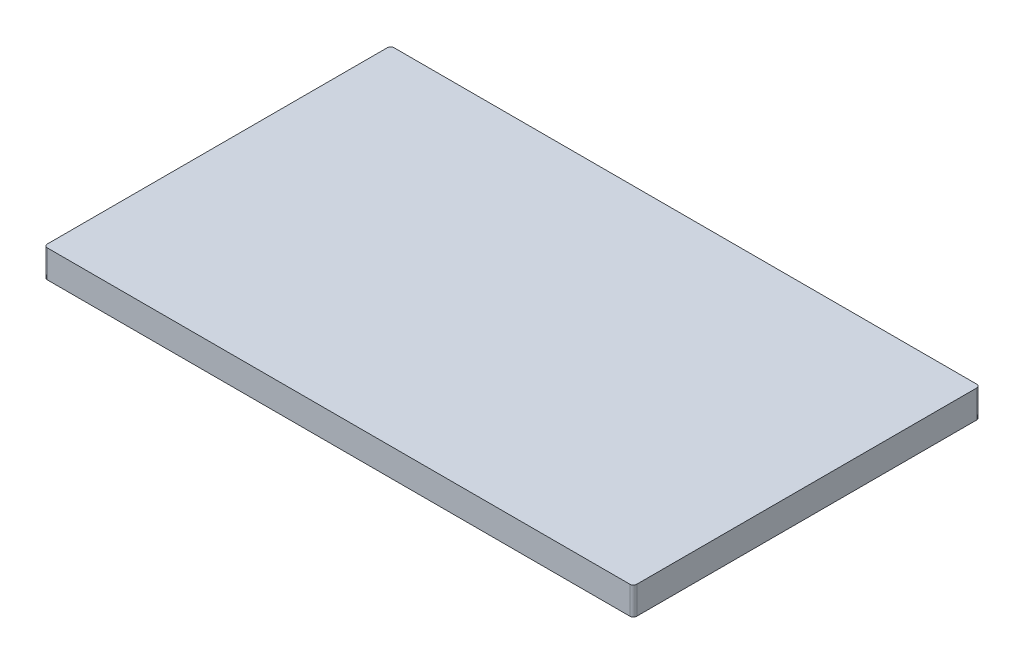
ISO-10303-21;
HEADER;
FILE_DESCRIPTION(('STEP AP214'),'2;1');
FILE_NAME('part.step','',(''),(''),'','','');
FILE_SCHEMA(('AUTOMOTIVE_DESIGN { 1 0 10303 214 1 1 1 1 }'));
ENDSEC;
DATA;
#1=APPLICATION_CONTEXT('core data for automotive mechanical design processes');
#2=APPLICATION_PROTOCOL_DEFINITION('international standard','automotive_design',2000,#1);
#3=PRODUCT_CONTEXT('',#1,'mechanical');
#4=PRODUCT('Part','Part','',(#3));
#5=PRODUCT_RELATED_PRODUCT_CATEGORY('part','',(#4));
#6=PRODUCT_DEFINITION_FORMATION('','',#4);
#7=PRODUCT_DEFINITION_CONTEXT('part definition',#1,'design');
#8=PRODUCT_DEFINITION('design','',#6,#7);
#9=PRODUCT_DEFINITION_SHAPE('','',#8);
#10=(LENGTH_UNIT() NAMED_UNIT(*) SI_UNIT(.MILLI.,.METRE.));
#11=(NAMED_UNIT(*) PLANE_ANGLE_UNIT() SI_UNIT($,.RADIAN.));
#12=(NAMED_UNIT(*) SI_UNIT($,.STERADIAN.) SOLID_ANGLE_UNIT());
#13=UNCERTAINTY_MEASURE_WITH_UNIT(LENGTH_MEASURE(1.E-05),#10,'distance_accuracy_value','');
#14=(GEOMETRIC_REPRESENTATION_CONTEXT(3) GLOBAL_UNCERTAINTY_ASSIGNED_CONTEXT((#13)) GLOBAL_UNIT_ASSIGNED_CONTEXT((#10,
#11,#12)) REPRESENTATION_CONTEXT('',''));
#15=CARTESIAN_POINT('',(0.,0.,0.));
#16=DIRECTION('',(0.,0.,1.));
#17=DIRECTION('',(1.,0.,0.));
#18=AXIS2_PLACEMENT_3D('',#15,#16,#17);
#19=CARTESIAN_POINT('',(0.,8.,0.));
#20=DIRECTION('',(1.,0.,0.));
#21=DIRECTION('',(0.,0.,-1.));
#22=AXIS2_PLACEMENT_3D('',#19,#20,#21);
#23=PLANE('',#22);
#24=DIRECTION('',(0.,0.,1.));
#25=VECTOR('',#24,1.);
#26=CARTESIAN_POINT('',(0.,8.,0.));
#27=LINE('',#26,#25);
#28=CARTESIAN_POINT('',(0.,8.,-99.));
#29=VERTEX_POINT('',#28);
#30=CARTESIAN_POINT('',(0.,8.,-1.));
#31=VERTEX_POINT('',#30);
#32=EDGE_CURVE('E125',#29,#31,#27,.T.);
#33=ORIENTED_EDGE('',*,*,#32,.F.);
#34=DIRECTION('',(0.,-1.,0.));
#35=VECTOR('',#34,1.);
#36=CARTESIAN_POINT('',(0.,8.,-99.));
#37=LINE('',#36,#35);
#38=CARTESIAN_POINT('',(0.,0.,-99.));
#39=VERTEX_POINT('',#38);
#40=EDGE_CURVE('E109',#29,#39,#37,.T.);
#41=ORIENTED_EDGE('',*,*,#40,.T.);
#42=DIRECTION('',(0.,0.,1.));
#43=VECTOR('',#42,1.);
#44=CARTESIAN_POINT('',(0.,0.,0.));
#45=LINE('',#44,#43);
#46=CARTESIAN_POINT('',(0.,0.,-1.));
#47=VERTEX_POINT('',#46);
#48=EDGE_CURVE('E122',#39,#47,#45,.T.);
#49=ORIENTED_EDGE('',*,*,#48,.T.);
#50=DIRECTION('',(0.,-1.,0.));
#51=VECTOR('',#50,1.);
#52=CARTESIAN_POINT('',(0.,8.,-1.));
#53=LINE('',#52,#51);
#54=EDGE_CURVE('E128',#47,#31,#53,.F.);
#55=ORIENTED_EDGE('',*,*,#54,.T.);
#56=EDGE_LOOP('',(#33,#41,#49,#55));
#57=FACE_BOUND('',#56,.T.);
#58=ADVANCED_FACE('F38',(#57),#23,.F.);
#59=CARTESIAN_POINT('',(0.,8.,0.));
#60=DIRECTION('',(0.,0.,-1.));
#61=DIRECTION('',(-1.,0.,0.));
#62=AXIS2_PLACEMENT_3D('',#59,#60,#61);
#63=PLANE('',#62);
#64=DIRECTION('',(1.,0.,0.));
#65=VECTOR('',#64,1.);
#66=CARTESIAN_POINT('',(0.,0.,0.));
#67=LINE('',#66,#65);
#68=CARTESIAN_POINT('',(1.,0.,0.));
#69=VERTEX_POINT('',#68);
#70=CARTESIAN_POINT('',(169.,0.,0.));
#71=VERTEX_POINT('',#70);
#72=EDGE_CURVE('E133',#69,#71,#67,.T.);
#73=ORIENTED_EDGE('',*,*,#72,.T.);
#74=DIRECTION('',(0.,-1.,0.));
#75=VECTOR('',#74,1.);
#76=CARTESIAN_POINT('',(169.,8.,0.));
#77=LINE('',#76,#75);
#78=CARTESIAN_POINT('',(169.,8.,0.));
#79=VERTEX_POINT('',#78);
#80=EDGE_CURVE('E11',#71,#79,#77,.F.);
#81=ORIENTED_EDGE('',*,*,#80,.T.);
#82=DIRECTION('',(1.,0.,0.));
#83=VECTOR('',#82,1.);
#84=CARTESIAN_POINT('',(0.,8.,0.));
#85=LINE('',#84,#83);
#86=CARTESIAN_POINT('',(1.,8.,0.));
#87=VERTEX_POINT('',#86);
#88=EDGE_CURVE('E185',#87,#79,#85,.T.);
#89=ORIENTED_EDGE('',*,*,#88,.F.);
#90=DIRECTION('',(0.,-1.,0.));
#91=VECTOR('',#90,1.);
#92=CARTESIAN_POINT('',(1.,8.,0.));
#93=LINE('',#92,#91);
#94=EDGE_CURVE('E47',#87,#69,#93,.T.);
#95=ORIENTED_EDGE('',*,*,#94,.T.);
#96=EDGE_LOOP('',(#73,#81,#89,#95));
#97=FACE_BOUND('',#96,.T.);
#98=ADVANCED_FACE('F183',(#97),#63,.F.);
#99=CARTESIAN_POINT('',(170.,8.,0.));
#100=DIRECTION('',(-1.,0.,0.));
#101=DIRECTION('',(0.,0.,1.));
#102=AXIS2_PLACEMENT_3D('',#99,#100,#101);
#103=PLANE('',#102);
#104=DIRECTION('',(0.,0.,-1.));
#105=VECTOR('',#104,1.);
#106=CARTESIAN_POINT('',(170.,0.,0.));
#107=LINE('',#106,#105);
#108=CARTESIAN_POINT('',(170.,0.,-1.));
#109=VERTEX_POINT('',#108);
#110=CARTESIAN_POINT('',(170.,0.,-99.));
#111=VERTEX_POINT('',#110);
#112=EDGE_CURVE('E137',#109,#111,#107,.T.);
#113=ORIENTED_EDGE('',*,*,#112,.T.);
#114=DIRECTION('',(0.,-1.,0.));
#115=VECTOR('',#114,1.);
#116=CARTESIAN_POINT('',(170.,8.,-99.));
#117=LINE('',#116,#115);
#118=CARTESIAN_POINT('',(170.,8.,-99.));
#119=VERTEX_POINT('',#118);
#120=EDGE_CURVE('E54',#111,#119,#117,.F.);
#121=ORIENTED_EDGE('',*,*,#120,.T.);
#122=DIRECTION('',(0.,0.,-1.));
#123=VECTOR('',#122,1.);
#124=CARTESIAN_POINT('',(170.,8.,0.));
#125=LINE('',#124,#123);
#126=CARTESIAN_POINT('',(170.,8.,-1.));
#127=VERTEX_POINT('',#126);
#128=EDGE_CURVE('E193',#127,#119,#125,.T.);
#129=ORIENTED_EDGE('',*,*,#128,.F.);
#130=DIRECTION('',(0.,-1.,0.));
#131=VECTOR('',#130,1.);
#132=CARTESIAN_POINT('',(170.,8.,-1.));
#133=LINE('',#132,#131);
#134=EDGE_CURVE('E173',#127,#109,#133,.T.);
#135=ORIENTED_EDGE('',*,*,#134,.T.);
#136=EDGE_LOOP('',(#113,#121,#129,#135));
#137=FACE_BOUND('',#136,.T.);
#138=ADVANCED_FACE('F192',(#137),#103,.F.);
#139=CARTESIAN_POINT('',(0.,8.,-100.));
#140=DIRECTION('',(0.,0.,1.));
#141=DIRECTION('',(1.,0.,0.));
#142=AXIS2_PLACEMENT_3D('',#139,#140,#141);
#143=PLANE('',#142);
#144=DIRECTION('',(-1.,0.,0.));
#145=VECTOR('',#144,1.);
#146=CARTESIAN_POINT('',(0.,0.,-100.));
#147=LINE('',#146,#145);
#148=CARTESIAN_POINT('',(169.,0.,-100.));
#149=VERTEX_POINT('',#148);
#150=CARTESIAN_POINT('',(1.,0.,-100.));
#151=VERTEX_POINT('',#150);
#152=EDGE_CURVE('E145',#149,#151,#147,.T.);
#153=ORIENTED_EDGE('',*,*,#152,.T.);
#154=DIRECTION('',(0.,-1.,0.));
#155=VECTOR('',#154,1.);
#156=CARTESIAN_POINT('',(1.,8.,-100.));
#157=LINE('',#156,#155);
#158=CARTESIAN_POINT('',(1.,8.,-100.));
#159=VERTEX_POINT('',#158);
#160=EDGE_CURVE('E110',#151,#159,#157,.F.);
#161=ORIENTED_EDGE('',*,*,#160,.T.);
#162=DIRECTION('',(-1.,0.,0.));
#163=VECTOR('',#162,1.);
#164=CARTESIAN_POINT('',(0.,8.,-100.));
#165=LINE('',#164,#163);
#166=CARTESIAN_POINT('',(169.,8.,-100.));
#167=VERTEX_POINT('',#166);
#168=EDGE_CURVE('E140',#167,#159,#165,.T.);
#169=ORIENTED_EDGE('',*,*,#168,.F.);
#170=DIRECTION('',(0.,-1.,0.));
#171=VECTOR('',#170,1.);
#172=CARTESIAN_POINT('',(169.,8.,-100.));
#173=LINE('',#172,#171);
#174=EDGE_CURVE('E116',#167,#149,#173,.T.);
#175=ORIENTED_EDGE('',*,*,#174,.T.);
#176=EDGE_LOOP('',(#153,#161,#169,#175));
#177=FACE_BOUND('',#176,.T.);
#178=ADVANCED_FACE('F225',(#177),#143,.F.);
#179=CARTESIAN_POINT('',(0.,8.,0.));
#180=DIRECTION('',(0.,-1.,0.));
#181=DIRECTION('',(0.,0.,-1.));
#182=AXIS2_PLACEMENT_3D('',#179,#180,#181);
#183=PLANE('',#182);
#184=ORIENTED_EDGE('',*,*,#168,.T.);
#185=CARTESIAN_POINT('',(1.,8.,-99.));
#186=DIRECTION('',(0.,-1.,0.));
#187=DIRECTION('',(0.,0.,-1.));
#188=AXIS2_PLACEMENT_3D('',#185,#186,#187);
#189=CIRCLE('',#188,1.);
#190=EDGE_CURVE('E170',#159,#29,#189,.F.);
#191=ORIENTED_EDGE('',*,*,#190,.T.);
#192=ORIENTED_EDGE('',*,*,#32,.T.);
#193=CARTESIAN_POINT('',(1.,8.,-1.));
#194=DIRECTION('',(0.,-1.,0.));
#195=DIRECTION('',(0.,0.,-1.));
#196=AXIS2_PLACEMENT_3D('',#193,#194,#195);
#197=CIRCLE('',#196,1.);
#198=EDGE_CURVE('E162',#31,#87,#197,.F.);
#199=ORIENTED_EDGE('',*,*,#198,.T.);
#200=ORIENTED_EDGE('',*,*,#88,.T.);
#201=CARTESIAN_POINT('',(169.,8.,-1.));
#202=DIRECTION('',(0.,-1.,0.));
#203=DIRECTION('',(0.,0.,-1.));
#204=AXIS2_PLACEMENT_3D('',#201,#202,#203);
#205=CIRCLE('',#204,1.);
#206=EDGE_CURVE('E61',#79,#127,#205,.F.);
#207=ORIENTED_EDGE('',*,*,#206,.T.);
#208=ORIENTED_EDGE('',*,*,#128,.T.);
#209=CARTESIAN_POINT('',(169.,8.,-99.));
#210=DIRECTION('',(0.,-1.,0.));
#211=DIRECTION('',(0.,0.,-1.));
#212=AXIS2_PLACEMENT_3D('',#209,#210,#211);
#213=CIRCLE('',#212,1.);
#214=EDGE_CURVE('E167',#119,#167,#213,.F.);
#215=ORIENTED_EDGE('',*,*,#214,.T.);
#216=EDGE_LOOP('',(#184,#191,#192,#199,#200,#207,#208,#215));
#217=FACE_BOUND('',#216,.T.);
#218=ADVANCED_FACE('F202',(#217),#183,.F.);
#219=CARTESIAN_POINT('',(0.,0.,0.));
#220=DIRECTION('',(0.,-1.,0.));
#221=DIRECTION('',(0.,0.,-1.));
#222=AXIS2_PLACEMENT_3D('',#219,#220,#221);
#223=PLANE('',#222);
#224=ORIENTED_EDGE('',*,*,#48,.F.);
#225=CARTESIAN_POINT('',(1.,0.,-99.));
#226=DIRECTION('',(0.,-1.,0.));
#227=DIRECTION('',(0.,0.,-1.));
#228=AXIS2_PLACEMENT_3D('',#225,#226,#227);
#229=CIRCLE('',#228,1.);
#230=EDGE_CURVE('E105',#39,#151,#229,.T.);
#231=ORIENTED_EDGE('',*,*,#230,.T.);
#232=ORIENTED_EDGE('',*,*,#152,.F.);
#233=CARTESIAN_POINT('',(169.,0.,-99.));
#234=DIRECTION('',(0.,-1.,0.));
#235=DIRECTION('',(0.,0.,-1.));
#236=AXIS2_PLACEMENT_3D('',#233,#234,#235);
#237=CIRCLE('',#236,1.);
#238=EDGE_CURVE('E117',#149,#111,#237,.T.);
#239=ORIENTED_EDGE('',*,*,#238,.T.);
#240=ORIENTED_EDGE('',*,*,#112,.F.);
#241=CARTESIAN_POINT('',(169.,0.,-1.));
#242=DIRECTION('',(0.,-1.,0.));
#243=DIRECTION('',(0.,0.,-1.));
#244=AXIS2_PLACEMENT_3D('',#241,#242,#243);
#245=CIRCLE('',#244,1.);
#246=EDGE_CURVE('E152',#109,#71,#245,.T.);
#247=ORIENTED_EDGE('',*,*,#246,.T.);
#248=ORIENTED_EDGE('',*,*,#72,.F.);
#249=CARTESIAN_POINT('',(1.,0.,-1.));
#250=DIRECTION('',(0.,-1.,0.));
#251=DIRECTION('',(0.,0.,-1.));
#252=AXIS2_PLACEMENT_3D('',#249,#250,#251);
#253=CIRCLE('',#252,1.);
#254=EDGE_CURVE('E127',#69,#47,#253,.T.);
#255=ORIENTED_EDGE('',*,*,#254,.T.);
#256=EDGE_LOOP('',(#224,#231,#232,#239,#240,#247,#248,#255));
#257=FACE_BOUND('',#256,.T.);
#258=ADVANCED_FACE('F130',(#257),#223,.T.);
#259=CARTESIAN_POINT('',(1.,8.,-99.));
#260=DIRECTION('',(0.,-1.,0.));
#261=DIRECTION('',(0.,0.,-1.));
#262=AXIS2_PLACEMENT_3D('',#259,#260,#261);
#263=CYLINDRICAL_SURFACE('',#262,1.);
#264=ORIENTED_EDGE('',*,*,#190,.F.);
#265=ORIENTED_EDGE('',*,*,#160,.F.);
#266=ORIENTED_EDGE('',*,*,#230,.F.);
#267=ORIENTED_EDGE('',*,*,#40,.F.);
#268=EDGE_LOOP('',(#264,#265,#266,#267));
#269=FACE_BOUND('',#268,.T.);
#270=ADVANCED_FACE('F108',(#269),#263,.T.);
#271=CARTESIAN_POINT('',(169.,8.,-99.));
#272=DIRECTION('',(0.,-1.,0.));
#273=DIRECTION('',(0.,0.,-1.));
#274=AXIS2_PLACEMENT_3D('',#271,#272,#273);
#275=CYLINDRICAL_SURFACE('',#274,1.);
#276=ORIENTED_EDGE('',*,*,#214,.F.);
#277=ORIENTED_EDGE('',*,*,#120,.F.);
#278=ORIENTED_EDGE('',*,*,#238,.F.);
#279=ORIENTED_EDGE('',*,*,#174,.F.);
#280=EDGE_LOOP('',(#276,#277,#278,#279));
#281=FACE_BOUND('',#280,.T.);
#282=ADVANCED_FACE('F207',(#281),#275,.T.);
#283=CARTESIAN_POINT('',(169.,8.,-1.));
#284=DIRECTION('',(0.,-1.,0.));
#285=DIRECTION('',(0.,0.,-1.));
#286=AXIS2_PLACEMENT_3D('',#283,#284,#285);
#287=CYLINDRICAL_SURFACE('',#286,1.);
#288=ORIENTED_EDGE('',*,*,#206,.F.);
#289=ORIENTED_EDGE('',*,*,#80,.F.);
#290=ORIENTED_EDGE('',*,*,#246,.F.);
#291=ORIENTED_EDGE('',*,*,#134,.F.);
#292=EDGE_LOOP('',(#288,#289,#290,#291));
#293=FACE_BOUND('',#292,.T.);
#294=ADVANCED_FACE('F191',(#293),#287,.T.);
#295=CARTESIAN_POINT('',(1.,8.,-1.));
#296=DIRECTION('',(0.,-1.,0.));
#297=DIRECTION('',(0.,0.,-1.));
#298=AXIS2_PLACEMENT_3D('',#295,#296,#297);
#299=CYLINDRICAL_SURFACE('',#298,1.);
#300=ORIENTED_EDGE('',*,*,#198,.F.);
#301=ORIENTED_EDGE('',*,*,#54,.F.);
#302=ORIENTED_EDGE('',*,*,#254,.F.);
#303=ORIENTED_EDGE('',*,*,#94,.F.);
#304=EDGE_LOOP('',(#300,#301,#302,#303));
#305=FACE_BOUND('',#304,.T.);
#306=ADVANCED_FACE('F40',(#305),#299,.T.);
#307=CLOSED_SHELL('',(#58,#98,#138,#178,#218,#258,#270,#282,#294,#306));
#308=MANIFOLD_SOLID_BREP('B2',#307);
#309=ADVANCED_BREP_SHAPE_REPRESENTATION('',(#18,#308),#14);
#310=SHAPE_DEFINITION_REPRESENTATION(#9,#309);
ENDSEC;
END-ISO-10303-21;
